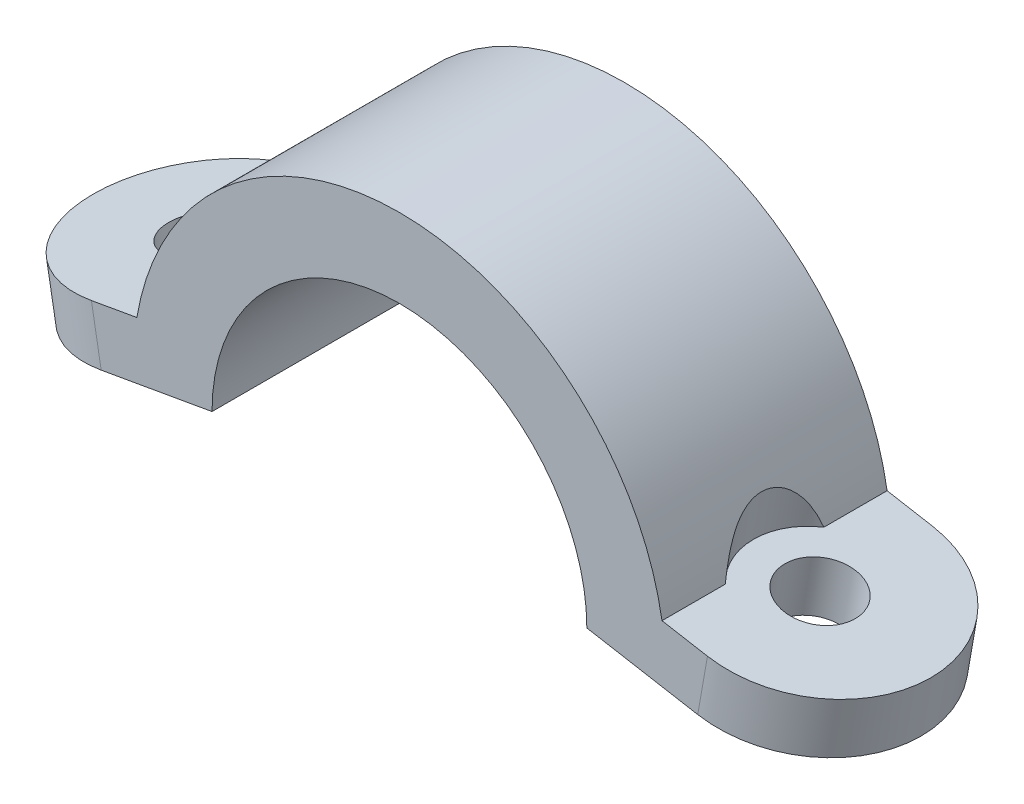
ISO-10303-21;
HEADER;
FILE_DESCRIPTION(('STEP AP214'),'2;1');
FILE_NAME('part.step','',(''),(''),'','','');
FILE_SCHEMA(('AUTOMOTIVE_DESIGN { 1 0 10303 214 1 1 1 1 }'));
ENDSEC;
DATA;
#1=APPLICATION_CONTEXT('core data for automotive mechanical design processes');
#2=APPLICATION_PROTOCOL_DEFINITION('international standard','automotive_design',2000,#1);
#3=PRODUCT_CONTEXT('',#1,'mechanical');
#4=PRODUCT('Part','Part','',(#3));
#5=PRODUCT_RELATED_PRODUCT_CATEGORY('part','',(#4));
#6=PRODUCT_DEFINITION_FORMATION('','',#4);
#7=PRODUCT_DEFINITION_CONTEXT('part definition',#1,'design');
#8=PRODUCT_DEFINITION('design','',#6,#7);
#9=PRODUCT_DEFINITION_SHAPE('','',#8);
#10=(LENGTH_UNIT() NAMED_UNIT(*) SI_UNIT(.MILLI.,.METRE.));
#11=(NAMED_UNIT(*) PLANE_ANGLE_UNIT() SI_UNIT($,.RADIAN.));
#12=(NAMED_UNIT(*) SI_UNIT($,.STERADIAN.) SOLID_ANGLE_UNIT());
#13=UNCERTAINTY_MEASURE_WITH_UNIT(LENGTH_MEASURE(1.E-05),#10,'distance_accuracy_value','');
#14=(GEOMETRIC_REPRESENTATION_CONTEXT(3) GLOBAL_UNCERTAINTY_ASSIGNED_CONTEXT((#13)) GLOBAL_UNIT_ASSIGNED_CONTEXT((#10,
#11,#12)) REPRESENTATION_CONTEXT('',''));
#15=CARTESIAN_POINT('',(0.,0.,0.));
#16=DIRECTION('',(0.,0.,1.));
#17=DIRECTION('',(1.,0.,0.));
#18=AXIS2_PLACEMENT_3D('',#15,#16,#17);
#19=CARTESIAN_POINT('',(0.,0.,20.));
#20=DIRECTION('',(0.,0.,-1.));
#21=DIRECTION('',(-1.,0.,0.));
#22=AXIS2_PLACEMENT_3D('',#19,#20,#21);
#23=CYLINDRICAL_SURFACE('',#22,23.65);
#24=CARTESIAN_POINT('',(23.3262302661561,3.89993353408295,5.62162046199867));
#25=CARTESIAN_POINT('',(23.30644063088,4.01830574828801,5.65914685636932));
#26=CARTESIAN_POINT('',(23.2858340207441,4.13600833364123,5.698336741421));
#27=CARTESIAN_POINT('',(23.2430778014222,4.36989342017987,5.78035355155573));
#28=CARTESIAN_POINT('',(23.2209277466485,4.48607547079663,5.82318152773288));
#29=CARTESIAN_POINT('',(23.1520998709963,4.83306100170746,5.95797901179696));
#30=CARTESIAN_POINT('',(23.103233955309,5.0611761257919,6.05591172927512));
#31=CARTESIAN_POINT('',(23.0000881375494,5.51113231345819,6.27196137903151));
#32=CARTESIAN_POINT('',(22.9457339856008,5.73281411546376,6.39037678934937));
#33=CARTESIAN_POINT('',(22.8342591825166,6.1618160346081,6.64918660241894));
#34=CARTESIAN_POINT('',(22.777145147347,6.36916785820421,6.78953008482778));
#35=CARTESIAN_POINT('',(22.6938644765552,6.65732507941525,7.0125063737805));
#36=CARTESIAN_POINT('',(22.66768867523,6.74584966364356,7.08523235587953));
#37=CARTESIAN_POINT('',(22.6157002612565,6.9181426676321,7.2362423707766));
#38=CARTESIAN_POINT('',(22.5898876658318,7.00191086240939,7.31452666609602));
#39=CARTESIAN_POINT('',(22.5137428337513,7.24447467954204,7.55758097791922));
#40=CARTESIAN_POINT('',(22.4645181908066,7.39516235951955,7.73103113285478));
#41=CARTESIAN_POINT('',(22.3724773496485,7.66916097569432,8.10439597728289));
#42=CARTESIAN_POINT('',(22.3297600631386,7.79206094728604,8.30464591160251));
#43=CARTESIAN_POINT('',(22.2750088713606,7.94666580474151,8.62089499790402));
#44=CARTESIAN_POINT('',(22.258314997512,7.99323691596019,8.72893392743267));
#45=CARTESIAN_POINT('',(22.228630559202,8.07541813228157,8.94956629874146));
#46=CARTESIAN_POINT('',(22.2156384371262,8.1110328480949,9.06215780205942));
#47=CARTESIAN_POINT('',(22.1889189597806,8.18392158066792,9.34353259244806));
#48=CARTESIAN_POINT('',(22.1775955735325,8.21444209323236,9.51436910694279));
#49=CARTESIAN_POINT('',(22.1651897700312,8.24785993174048,9.85900744635899));
#50=CARTESIAN_POINT('',(22.1641023127519,8.25077085226043,10.0328077697047));
#51=CARTESIAN_POINT('',(22.1722603902379,8.22882083807344,10.3783103656316));
#52=CARTESIAN_POINT('',(22.1815017567884,8.20397110622752,10.5500134562955));
#53=CARTESIAN_POINT('',(22.2093718815741,8.12821605867643,10.8867605861366));
#54=CARTESIAN_POINT('',(22.2280053124631,8.07729777338462,11.0518012665051));
#55=CARTESIAN_POINT('',(22.2736589868483,7.95054909332716,11.3765913223605));
#56=CARTESIAN_POINT('',(22.3009178115955,7.87400589341103,11.5360255355923));
#57=CARTESIAN_POINT('',(22.3614180371012,7.70051678589739,11.8418506873154));
#58=CARTESIAN_POINT('',(22.3946578977151,7.60357612965403,11.9882449691747));
#59=CARTESIAN_POINT('',(22.4864922524214,7.32882613337282,12.35248277158));
#60=CARTESIAN_POINT('',(22.5482036268907,7.13771152260392,12.5595718605891));
#61=CARTESIAN_POINT('',(22.6430822843764,6.82827129091435,12.8450463161906));
#62=CARTESIAN_POINT('',(22.6752220107078,6.72087188153151,12.9363134195287));
#63=CARTESIAN_POINT('',(22.7395957916161,6.4997303741187,13.1107899595754));
#64=CARTESIAN_POINT('',(22.7718298263305,6.38598953170413,13.1940009825369));
#65=CARTESIAN_POINT('',(22.8536969181584,6.08821682741531,13.3972876428312));
#66=CARTESIAN_POINT('',(22.902987706775,5.90042131912302,13.5119813970145));
#67=CARTESIAN_POINT('',(22.9988254038007,5.51507487681429,13.7253114443495));
#68=CARTESIAN_POINT('',(23.0453689168046,5.31751240347259,13.8239281221154));
#69=CARTESIAN_POINT('',(23.1336298954475,4.91919048614133,14.0051637203338));
#70=CARTESIAN_POINT('',(23.1754259166309,4.71857646600804,14.0880658047662));
#71=CARTESIAN_POINT('',(23.2346739329079,4.41396772271329,14.2034133696097));
#72=CARTESIAN_POINT('',(23.253825627743,4.31195566036316,14.2403182891578));
#73=CARTESIAN_POINT('',(23.2909369524817,4.10677799442416,14.3113677880365));
#74=CARTESIAN_POINT('',(23.3088967730166,4.00361257840466,14.3455128089835));
#75=CARTESIAN_POINT('',(23.3262302661561,3.89993353408304,14.3783795380015));
#76=B_SPLINE_CURVE_WITH_KNOTS('',3,(#24,#25,#26,#27,#28,#29,#30,#31,#32,#33,#34,#35,#36,#37,#38,
#39,#40,#41,#42,#43,#44,#45,#46,#47,#48,#49,#50,#51,#52,#53,#54,#55,#56,#57,#58,#59,#60,#61,#62,
#63,#64,#65,#66,#67,#68,#69,#70,#71,#72,#73,#74,#75),.UNSPECIFIED.,.F.,.F.,(4,2,2,2,2,2,2,2,2,2,
2,2,2,2,2,2,2,2,2,2,2,2,2,2,2,4),(0.,0.377203749385287,0.754516851159406,1.51272342244784,
2.28308804677755,3.05168964891729,3.40405008686208,3.75642717801792,4.45875573970466,
5.17087588748536,5.52679401462112,5.88256215744605,6.40176285143594,6.92070788499937,
7.4394435729908,7.95843759272381,8.49326932112514,9.0279635244455,9.888147145059,
10.3215891301265,10.7549455955862,11.4304506030711,12.10677371327,12.769421085989,
13.0998625865491,13.4302511074733),.UNSPECIFIED.);
#77=CARTESIAN_POINT('',(23.3262302661561,3.89993353408295,5.62162046199867));
#78=VERTEX_POINT('',#77);
#79=CARTESIAN_POINT('',(23.3262302661561,3.89993353408295,14.3783795380013));
#80=VERTEX_POINT('',#79);
#81=EDGE_CURVE('E111',#78,#80,#76,.T.);
#82=ORIENTED_EDGE('',*,*,#81,.F.);
#83=DIRECTION('',(0.,0.,-1.));
#84=VECTOR('',#83,1.);
#85=CARTESIAN_POINT('',(23.3262302661561,3.89993353408295,20.));
#86=LINE('',#85,#84);
#87=CARTESIAN_POINT('',(23.3262302661561,3.89993353408295,0.));
#88=VERTEX_POINT('',#87);
#89=EDGE_CURVE('E116',#88,#78,#86,.F.);
#90=ORIENTED_EDGE('',*,*,#89,.F.);
#91=CARTESIAN_POINT('',(0.,0.,0.));
#92=DIRECTION('',(0.,0.,1.));
#93=DIRECTION('',(1.,0.,0.));
#94=AXIS2_PLACEMENT_3D('',#91,#92,#93);
#95=CIRCLE('',#94,23.65);
#96=CARTESIAN_POINT('',(-23.3262302661561,3.89993353408292,0.));
#97=VERTEX_POINT('',#96);
#98=EDGE_CURVE('E148',#88,#97,#95,.T.);
#99=ORIENTED_EDGE('',*,*,#98,.T.);
#100=DIRECTION('',(0.,0.,-1.));
#101=VECTOR('',#100,1.);
#102=CARTESIAN_POINT('',(-23.3262302661561,3.89993353408292,20.));
#103=LINE('',#102,#101);
#104=CARTESIAN_POINT('',(-23.3262302661561,3.89993353408292,5.62162046199861));
#105=VERTEX_POINT('',#104);
#106=EDGE_CURVE('E192',#105,#97,#103,.T.);
#107=ORIENTED_EDGE('',*,*,#106,.F.);
#108=CARTESIAN_POINT('',(-23.3262302661561,3.89993353408292,14.3783795380014));
#109=CARTESIAN_POINT('',(-23.30644063088,4.01830574828797,14.3408531436307));
#110=CARTESIAN_POINT('',(-23.2858340207441,4.1360083336412,14.3016632585791));
#111=CARTESIAN_POINT('',(-23.2430778014222,4.36989342017984,14.2196464484443));
#112=CARTESIAN_POINT('',(-23.2209277466485,4.48607547079659,14.1768184722672));
#113=CARTESIAN_POINT('',(-23.1520998709963,4.83306100170743,14.0420209882031));
#114=CARTESIAN_POINT('',(-23.103233955309,5.06117612579187,13.944088270725));
#115=CARTESIAN_POINT('',(-23.0000881375494,5.51113231345816,13.7280386209686));
#116=CARTESIAN_POINT('',(-22.9457339856008,5.73281411546374,13.6096232106507));
#117=CARTESIAN_POINT('',(-22.8342591825166,6.16181603460808,13.3508133975812));
#118=CARTESIAN_POINT('',(-22.777145147347,6.3691678582042,13.2104699151723));
#119=CARTESIAN_POINT('',(-22.6938644765552,6.65732507941525,12.9874936262196));
#120=CARTESIAN_POINT('',(-22.66768867523,6.74584966364356,12.9147676441206));
#121=CARTESIAN_POINT('',(-22.6157002612565,6.91814266763211,12.7637576292235));
#122=CARTESIAN_POINT('',(-22.5898876658318,7.00191086240941,12.6854733339041));
#123=CARTESIAN_POINT('',(-22.5137428337513,7.24447467954207,12.4424190220809));
#124=CARTESIAN_POINT('',(-22.4645181908066,7.39516235951959,12.2689688671453));
#125=CARTESIAN_POINT('',(-22.3724773496485,7.66916097569437,11.8956040227172));
#126=CARTESIAN_POINT('',(-22.3297600631385,7.7920609472861,11.6953540883976));
#127=CARTESIAN_POINT('',(-22.2750088713605,7.94666580474159,11.3791050020961));
#128=CARTESIAN_POINT('',(-22.258314997512,7.99323691596027,11.2710660725674));
#129=CARTESIAN_POINT('',(-22.228630559202,8.07541813228166,11.0504337012586));
#130=CARTESIAN_POINT('',(-22.2156384371261,8.11103284809499,10.9378421979407));
#131=CARTESIAN_POINT('',(-22.1889189597805,8.18392158066801,10.656467407552));
#132=CARTESIAN_POINT('',(-22.1775955735324,8.21444209323247,10.4856308930573));
#133=CARTESIAN_POINT('',(-22.1651897700311,8.24785993174059,10.1409925536411));
#134=CARTESIAN_POINT('',(-22.1641023127519,8.25077085226055,9.96719223029536));
#135=CARTESIAN_POINT('',(-22.1722603902379,8.22882083807358,9.6216896343685));
#136=CARTESIAN_POINT('',(-22.1815017567884,8.20397110622766,9.44998654370463));
#137=CARTESIAN_POINT('',(-22.209371881574,8.12821605867657,9.1132394138635));
#138=CARTESIAN_POINT('',(-22.2280053124631,8.07729777338478,8.94819873349494));
#139=CARTESIAN_POINT('',(-22.2736589868483,7.95054909332732,8.62340867763959));
#140=CARTESIAN_POINT('',(-22.3009178115954,7.87400589341119,8.46397446440773));
#141=CARTESIAN_POINT('',(-22.3614180371011,7.70051678589757,8.1581493126847));
#142=CARTESIAN_POINT('',(-22.3946578977151,7.60357612965421,8.01175503082536));
#143=CARTESIAN_POINT('',(-22.4864922524214,7.32882613337302,7.64751722842004));
#144=CARTESIAN_POINT('',(-22.5482036268907,7.13771152260413,7.440428139411));
#145=CARTESIAN_POINT('',(-22.6430822843763,6.82827129091457,7.15495368380944));
#146=CARTESIAN_POINT('',(-22.6752220107077,6.72087188153173,7.06368658047142));
#147=CARTESIAN_POINT('',(-22.739595791616,6.49973037411894,6.88921004042465));
#148=CARTESIAN_POINT('',(-22.7718298263305,6.38598953170437,6.80599901746321));
#149=CARTESIAN_POINT('',(-22.8536969181583,6.08821682741554,6.60271235716882));
#150=CARTESIAN_POINT('',(-22.9029877067749,5.90042131912323,6.48801860298552));
#151=CARTESIAN_POINT('',(-22.9988254038007,5.51507487681446,6.27468855565052));
#152=CARTESIAN_POINT('',(-23.0453689168045,5.31751240347273,6.17607187788457));
#153=CARTESIAN_POINT('',(-23.1336298954474,4.91919048614142,5.99483627966613));
#154=CARTESIAN_POINT('',(-23.1754259166309,4.71857646600811,5.91193419523377));
#155=CARTESIAN_POINT('',(-23.2346739329079,4.41396772271332,5.79658663039021));
#156=CARTESIAN_POINT('',(-23.253825627743,4.31195566036318,5.75968171084215));
#157=CARTESIAN_POINT('',(-23.2909369524817,4.10677799442415,5.6886322119634));
#158=CARTESIAN_POINT('',(-23.3088967730166,4.00361257840464,5.65448719101644));
#159=CARTESIAN_POINT('',(-23.3262302661561,3.89993353408301,5.62162046199848));
#160=B_SPLINE_CURVE_WITH_KNOTS('',3,(#108,#109,#110,#111,#112,#113,#114,#115,#116,#117,#118,
#119,#120,#121,#122,#123,#124,#125,#126,#127,#128,#129,#130,#131,#132,#133,#134,#135,#136,#137,
#138,#139,#140,#141,#142,#143,#144,#145,#146,#147,#148,#149,#150,#151,#152,#153,#154,#155,#156,
#157,#158,#159),.UNSPECIFIED.,.F.,.F.,(4,2,2,2,2,2,2,2,2,2,2,2,2,2,2,2,2,2,2,2,2,2,2,2,2,4),(0.,
0.377203749385286,0.754516851159404,1.51272342244784,2.28308804677755,3.05168964891729,
3.40405008686209,3.75642717801794,4.4587557397047,5.17087588748542,5.52679401462119,
5.88256215744613,6.40176285143603,6.92070788499945,7.43944357299089,7.9584375927239,
8.49326932112522,9.02796352444558,9.88814714505906,10.3215891301265,10.7549455955862,
11.4304506030712,12.1067737132702,12.7694210859893,13.0998625865494,13.4302511074736),.UNSPECIFIED.);
#161=CARTESIAN_POINT('',(-23.3262302661561,3.89993353408292,14.3783795380014));
#162=VERTEX_POINT('',#161);
#163=EDGE_CURVE('E218',#162,#105,#160,.T.);
#164=ORIENTED_EDGE('',*,*,#163,.F.);
#165=CARTESIAN_POINT('',(-23.3262302661561,3.89993353408292,20.));
#166=VERTEX_POINT('',#165);
#167=EDGE_CURVE('E195',#166,#162,#103,.T.);
#168=ORIENTED_EDGE('',*,*,#167,.F.);
#169=CARTESIAN_POINT('',(0.,0.,20.));
#170=DIRECTION('',(0.,0.,1.));
#171=DIRECTION('',(1.,0.,0.));
#172=AXIS2_PLACEMENT_3D('',#169,#170,#171);
#173=CIRCLE('',#172,23.65);
#174=CARTESIAN_POINT('',(23.3262302661561,3.89993353408295,20.));
#175=VERTEX_POINT('',#174);
#176=EDGE_CURVE('E142',#175,#166,#173,.T.);
#177=ORIENTED_EDGE('',*,*,#176,.F.);
#178=EDGE_CURVE('E119',#80,#175,#86,.F.);
#179=ORIENTED_EDGE('',*,*,#178,.F.);
#180=EDGE_LOOP('',(#82,#90,#99,#107,#164,#168,#177,#179));
#181=FACE_BOUND('',#180,.T.);
#182=ADVANCED_FACE('F34',(#181),#23,.T.);
#183=CARTESIAN_POINT('',(0.,0.,20.));
#184=DIRECTION('',(0.,0.,-1.));
#185=DIRECTION('',(-1.,0.,0.));
#186=AXIS2_PLACEMENT_3D('',#183,#184,#185);
#187=CYLINDRICAL_SURFACE('',#186,16.65);
#188=CARTESIAN_POINT('',(0.,0.,0.));
#189=DIRECTION('',(0.,0.,-1.));
#190=DIRECTION('',(1.,0.,0.));
#191=AXIS2_PLACEMENT_3D('',#188,#189,#190);
#192=CIRCLE('',#191,16.65);
#193=CARTESIAN_POINT('',(-16.65,0.,0.));
#194=VERTEX_POINT('',#193);
#195=CARTESIAN_POINT('',(16.65,0.,0.));
#196=VERTEX_POINT('',#195);
#197=EDGE_CURVE('E126',#194,#196,#192,.T.);
#198=ORIENTED_EDGE('',*,*,#197,.T.);
#199=DIRECTION('',(0.,0.,-1.));
#200=VECTOR('',#199,1.);
#201=CARTESIAN_POINT('',(16.65,0.,20.));
#202=LINE('',#201,#200);
#203=CARTESIAN_POINT('',(16.65,0.,20.));
#204=VERTEX_POINT('',#203);
#205=EDGE_CURVE('E11',#204,#196,#202,.T.);
#206=ORIENTED_EDGE('',*,*,#205,.F.);
#207=CARTESIAN_POINT('',(0.,0.,20.));
#208=DIRECTION('',(0.,0.,-1.));
#209=DIRECTION('',(1.,0.,0.));
#210=AXIS2_PLACEMENT_3D('',#207,#208,#209);
#211=CIRCLE('',#210,16.65);
#212=CARTESIAN_POINT('',(-16.65,0.,20.));
#213=VERTEX_POINT('',#212);
#214=EDGE_CURVE('E136',#213,#204,#211,.T.);
#215=ORIENTED_EDGE('',*,*,#214,.F.);
#216=DIRECTION('',(0.,0.,-1.));
#217=VECTOR('',#216,1.);
#218=CARTESIAN_POINT('',(-16.65,0.,20.));
#219=LINE('',#218,#217);
#220=EDGE_CURVE('E42',#213,#194,#219,.T.);
#221=ORIENTED_EDGE('',*,*,#220,.T.);
#222=EDGE_LOOP('',(#198,#206,#215,#221));
#223=FACE_BOUND('',#222,.T.);
#224=ADVANCED_FACE('F36',(#223),#187,.F.);
#225=CARTESIAN_POINT('',(16.65,0.,20.));
#226=DIRECTION('',(0.173648177666931,0.984807753012208,0.));
#227=DIRECTION('',(-0.984807753012208,0.173648177666931,0.));
#228=AXIS2_PLACEMENT_3D('',#225,#226,#227);
#229=PLANE('',#228);
#230=CARTESIAN_POINT('',(26.4980775301221,-1.73648177666931,10.));
#231=DIRECTION('',(0.173648177666931,0.984807753012208,0.));
#232=DIRECTION('',(-0.984807753012208,0.173648177666931,0.));
#233=AXIS2_PLACEMENT_3D('',#230,#231,#232);
#234=CIRCLE('',#233,3.175);
#235=CARTESIAN_POINT('',(23.3713129143083,-1.1851488125768,10.));
#236=VERTEX_POINT('',#235);
#237=EDGE_CURVE('E313',#236,#236,#234,.T.);
#238=ORIENTED_EDGE('',*,*,#237,.T.);
#239=EDGE_LOOP('',(#238));
#240=FACE_BOUND('',#239,.T.);
#241=DIRECTION('',(0.984807753012208,-0.173648177666931,0.));
#242=VECTOR('',#241,1.);
#243=CARTESIAN_POINT('',(16.65,0.,0.));
#244=LINE('',#243,#242);
#245=CARTESIAN_POINT('',(26.4980775301221,-1.73648177666931,0.));
#246=VERTEX_POINT('',#245);
#247=EDGE_CURVE('E129',#196,#246,#244,.T.);
#248=ORIENTED_EDGE('',*,*,#247,.T.);
#249=CARTESIAN_POINT('',(26.4980775301221,-1.73648177666931,10.));
#250=DIRECTION('',(-0.173648177666931,-0.984807753012208,0.));
#251=DIRECTION('',(0.984807753012208,-0.173648177666931,0.));
#252=AXIS2_PLACEMENT_3D('',#249,#250,#251);
#253=CIRCLE('',#252,10.);
#254=CARTESIAN_POINT('',(26.4980775301221,-1.73648177666931,20.));
#255=VERTEX_POINT('',#254);
#256=EDGE_CURVE('E166',#246,#255,#253,.T.);
#257=ORIENTED_EDGE('',*,*,#256,.T.);
#258=DIRECTION('',(0.984807753012208,-0.173648177666931,0.));
#259=VECTOR('',#258,1.);
#260=CARTESIAN_POINT('',(16.65,0.,20.));
#261=LINE('',#260,#259);
#262=EDGE_CURVE('E139',#204,#255,#261,.T.);
#263=ORIENTED_EDGE('',*,*,#262,.F.);
#264=ORIENTED_EDGE('',*,*,#205,.T.);
#265=EDGE_LOOP('',(#248,#257,#263,#264));
#266=FACE_BOUND('',#265,.T.);
#267=ADVANCED_FACE('F165',(#240,#266),#229,.F.);
#268=CARTESIAN_POINT('',(-16.65,0.,20.));
#269=DIRECTION('',(-0.173648177666924,0.984807753012209,0.));
#270=DIRECTION('',(-0.984807753012209,-0.173648177666924,0.));
#271=AXIS2_PLACEMENT_3D('',#268,#269,#270);
#272=PLANE('',#271);
#273=CARTESIAN_POINT('',(-26.4980775301221,-1.73648177666923,10.));
#274=DIRECTION('',(-0.173648177666924,0.984807753012209,0.));
#275=DIRECTION('',(-0.984807753012209,-0.173648177666924,0.));
#276=AXIS2_PLACEMENT_3D('',#273,#274,#275);
#277=CIRCLE('',#276,3.175);
#278=CARTESIAN_POINT('',(-29.6248421459358,-2.28781474076172,10.));
#279=VERTEX_POINT('',#278);
#280=EDGE_CURVE('E179',#279,#279,#277,.T.);
#281=ORIENTED_EDGE('',*,*,#280,.T.);
#282=EDGE_LOOP('',(#281));
#283=FACE_BOUND('',#282,.T.);
#284=DIRECTION('',(0.984807753012209,0.173648177666924,0.));
#285=VECTOR('',#284,1.);
#286=CARTESIAN_POINT('',(-16.65,0.,0.));
#287=LINE('',#286,#285);
#288=CARTESIAN_POINT('',(-26.4980775301221,-1.73648177666932,0.));
#289=VERTEX_POINT('',#288);
#290=EDGE_CURVE('E140',#289,#194,#287,.T.);
#291=ORIENTED_EDGE('',*,*,#290,.T.);
#292=ORIENTED_EDGE('',*,*,#220,.F.);
#293=DIRECTION('',(0.984807753012209,0.173648177666924,0.));
#294=VECTOR('',#293,1.);
#295=CARTESIAN_POINT('',(-16.65,0.,20.));
#296=LINE('',#295,#294);
#297=CARTESIAN_POINT('',(-26.4980775301221,-1.73648177666932,20.));
#298=VERTEX_POINT('',#297);
#299=EDGE_CURVE('E145',#298,#213,#296,.T.);
#300=ORIENTED_EDGE('',*,*,#299,.F.);
#301=CARTESIAN_POINT('',(-26.4980775301221,-1.73648177666932,10.));
#302=DIRECTION('',(0.173648177666927,-0.984807753012209,0.));
#303=DIRECTION('',(0.984807753012209,0.173648177666927,0.));
#304=AXIS2_PLACEMENT_3D('',#301,#302,#303);
#305=CIRCLE('',#304,10.);
#306=EDGE_CURVE('E176',#298,#289,#305,.T.);
#307=ORIENTED_EDGE('',*,*,#306,.T.);
#308=EDGE_LOOP('',(#291,#292,#300,#307));
#309=FACE_BOUND('',#308,.T.);
#310=ADVANCED_FACE('F175',(#283,#309),#272,.F.);
#311=CARTESIAN_POINT('',(0.,0.,20.));
#312=DIRECTION('',(0.,0.,1.));
#313=DIRECTION('',(1.,0.,0.));
#314=AXIS2_PLACEMENT_3D('',#311,#312,#313);
#315=PLANE('',#314);
#316=ORIENTED_EDGE('',*,*,#299,.T.);
#317=ORIENTED_EDGE('',*,*,#214,.T.);
#318=ORIENTED_EDGE('',*,*,#262,.T.);
#319=DIRECTION('',(-0.173648177666931,-0.984807753012208,0.));
#320=VECTOR('',#319,1.);
#321=CARTESIAN_POINT('',(27.3663184184567,3.18755698839173,20.));
#322=LINE('',#321,#320);
#323=CARTESIAN_POINT('',(27.3663184184567,3.18755698839173,20.));
#324=VERTEX_POINT('',#323);
#325=EDGE_CURVE('E134',#324,#255,#322,.T.);
#326=ORIENTED_EDGE('',*,*,#325,.F.);
#327=DIRECTION('',(-0.984807753012208,0.173648177666931,0.));
#328=VECTOR('',#327,1.);
#329=CARTESIAN_POINT('',(17.5182408883347,4.92403876506104,20.));
#330=LINE('',#329,#328);
#331=EDGE_CURVE('E200',#324,#175,#330,.T.);
#332=ORIENTED_EDGE('',*,*,#331,.T.);
#333=ORIENTED_EDGE('',*,*,#176,.T.);
#334=DIRECTION('',(-0.984807753012209,-0.173648177666927,0.));
#335=VECTOR('',#334,1.);
#336=CARTESIAN_POINT('',(-27.3663184184567,3.18755698839172,20.));
#337=LINE('',#336,#335);
#338=CARTESIAN_POINT('',(-27.3663184184567,3.18755698839172,20.));
#339=VERTEX_POINT('',#338);
#340=EDGE_CURVE('E189',#166,#339,#337,.T.);
#341=ORIENTED_EDGE('',*,*,#340,.T.);
#342=DIRECTION('',(0.173648177666927,-0.984807753012209,0.));
#343=VECTOR('',#342,1.);
#344=CARTESIAN_POINT('',(-27.3663184184567,3.18755698839172,20.));
#345=LINE('',#344,#343);
#346=EDGE_CURVE('E172',#339,#298,#345,.T.);
#347=ORIENTED_EDGE('',*,*,#346,.T.);
#348=EDGE_LOOP('',(#316,#317,#318,#326,#332,#333,#341,#347));
#349=FACE_BOUND('',#348,.T.);
#350=ADVANCED_FACE('F169',(#349),#315,.T.);
#351=CARTESIAN_POINT('',(0.,0.,0.));
#352=DIRECTION('',(0.,0.,1.));
#353=DIRECTION('',(1.,0.,0.));
#354=AXIS2_PLACEMENT_3D('',#351,#352,#353);
#355=PLANE('',#354);
#356=ORIENTED_EDGE('',*,*,#197,.F.);
#357=ORIENTED_EDGE('',*,*,#290,.F.);
#358=DIRECTION('',(0.173648177666927,-0.984807753012209,0.));
#359=VECTOR('',#358,1.);
#360=CARTESIAN_POINT('',(-27.3663184184567,3.18755698839172,0.));
#361=LINE('',#360,#359);
#362=CARTESIAN_POINT('',(-27.3663184184567,3.18755698839172,0.));
#363=VERTEX_POINT('',#362);
#364=EDGE_CURVE('E193',#363,#289,#361,.T.);
#365=ORIENTED_EDGE('',*,*,#364,.F.);
#366=DIRECTION('',(0.984807753012209,0.173648177666927,0.));
#367=VECTOR('',#366,1.);
#368=CARTESIAN_POINT('',(-17.5182408883346,4.92403876506099,0.));
#369=LINE('',#368,#367);
#370=EDGE_CURVE('E182',#363,#97,#369,.T.);
#371=ORIENTED_EDGE('',*,*,#370,.T.);
#372=ORIENTED_EDGE('',*,*,#98,.F.);
#373=DIRECTION('',(0.984807753012208,-0.173648177666931,0.));
#374=VECTOR('',#373,1.);
#375=CARTESIAN_POINT('',(27.3663184184567,3.18755698839173,0.));
#376=LINE('',#375,#374);
#377=CARTESIAN_POINT('',(27.3663184184567,3.18755698839173,0.));
#378=VERTEX_POINT('',#377);
#379=EDGE_CURVE('E125',#88,#378,#376,.T.);
#380=ORIENTED_EDGE('',*,*,#379,.T.);
#381=DIRECTION('',(-0.173648177666931,-0.984807753012208,0.));
#382=VECTOR('',#381,1.);
#383=CARTESIAN_POINT('',(27.3663184184567,3.18755698839173,0.));
#384=LINE('',#383,#382);
#385=EDGE_CURVE('E131',#378,#246,#384,.T.);
#386=ORIENTED_EDGE('',*,*,#385,.T.);
#387=ORIENTED_EDGE('',*,*,#247,.F.);
#388=EDGE_LOOP('',(#356,#357,#365,#371,#372,#380,#386,#387));
#389=FACE_BOUND('',#388,.T.);
#390=ADVANCED_FACE('F158',(#389),#355,.F.);
#391=CARTESIAN_POINT('',(27.3663184184567,3.18755698839173,10.));
#392=DIRECTION('',(-0.173648177666931,-0.984807753012208,0.));
#393=DIRECTION('',(0.984807753012208,-0.173648177666931,0.));
#394=AXIS2_PLACEMENT_3D('',#391,#392,#393);
#395=PLANE('',#394);
#396=CARTESIAN_POINT('',(27.3663184184567,3.18755698839173,10.));
#397=DIRECTION('',(0.173648177666931,0.984807753012208,0.));
#398=DIRECTION('',(-0.984807753012208,0.173648177666931,0.));
#399=AXIS2_PLACEMENT_3D('',#396,#397,#398);
#400=CIRCLE('',#399,3.175);
#401=CARTESIAN_POINT('',(24.239553802643,3.73888995248423,10.));
#402=VERTEX_POINT('',#401);
#403=EDGE_CURVE('E120',#402,#402,#400,.T.);
#404=ORIENTED_EDGE('',*,*,#403,.F.);
#405=EDGE_LOOP('',(#404));
#406=FACE_BOUND('',#405,.T.);
#407=ORIENTED_EDGE('',*,*,#89,.T.);
#408=CARTESIAN_POINT('',(27.3663184184567,3.18755698839173,10.));
#409=DIRECTION('',(0.173648177666931,0.984807753012208,0.));
#410=DIRECTION('',(-0.984807753012208,0.173648177666931,0.));
#411=AXIS2_PLACEMENT_3D('',#408,#409,#410);
#412=CIRCLE('',#411,5.99999999999999);
#413=EDGE_CURVE('E49',#78,#80,#412,.T.);
#414=ORIENTED_EDGE('',*,*,#413,.T.);
#415=ORIENTED_EDGE('',*,*,#178,.T.);
#416=ORIENTED_EDGE('',*,*,#331,.F.);
#417=CARTESIAN_POINT('',(27.3663184184567,3.18755698839173,10.));
#418=DIRECTION('',(-0.173648177666931,-0.984807753012208,0.));
#419=DIRECTION('',(0.984807753012208,-0.173648177666931,0.));
#420=AXIS2_PLACEMENT_3D('',#417,#418,#419);
#421=CIRCLE('',#420,10.);
#422=EDGE_CURVE('E197',#378,#324,#421,.T.);
#423=ORIENTED_EDGE('',*,*,#422,.F.);
#424=ORIENTED_EDGE('',*,*,#379,.F.);
#425=EDGE_LOOP('',(#407,#414,#415,#416,#423,#424));
#426=FACE_BOUND('',#425,.T.);
#427=ADVANCED_FACE('F123',(#406,#426),#395,.F.);
#428=CARTESIAN_POINT('',(27.3663184184567,3.18755698839173,10.));
#429=DIRECTION('',(-0.173648177666931,-0.984807753012208,0.));
#430=DIRECTION('',(0.984807753012208,-0.173648177666931,0.));
#431=AXIS2_PLACEMENT_3D('',#428,#429,#430);
#432=CYLINDRICAL_SURFACE('',#431,10.);
#433=ORIENTED_EDGE('',*,*,#256,.F.);
#434=ORIENTED_EDGE('',*,*,#385,.F.);
#435=ORIENTED_EDGE('',*,*,#422,.T.);
#436=ORIENTED_EDGE('',*,*,#325,.T.);
#437=EDGE_LOOP('',(#433,#434,#435,#436));
#438=FACE_BOUND('',#437,.T.);
#439=ADVANCED_FACE('F205',(#438),#432,.T.);
#440=CARTESIAN_POINT('',(-27.3663184184567,3.18755698839172,10.));
#441=DIRECTION('',(0.173648177666927,-0.984807753012209,0.));
#442=DIRECTION('',(0.984807753012209,0.173648177666927,0.));
#443=AXIS2_PLACEMENT_3D('',#440,#441,#442);
#444=PLANE('',#443);
#445=CARTESIAN_POINT('',(-27.3663184184567,3.18755698839172,10.));
#446=DIRECTION('',(-0.173648177666927,0.984807753012209,0.));
#447=DIRECTION('',(-0.984807753012209,-0.173648177666927,0.));
#448=AXIS2_PLACEMENT_3D('',#445,#446,#447);
#449=CIRCLE('',#448,3.175);
#450=CARTESIAN_POINT('',(-30.4930830342705,2.63622402429923,10.));
#451=VERTEX_POINT('',#450);
#452=EDGE_CURVE('E185',#451,#451,#449,.T.);
#453=ORIENTED_EDGE('',*,*,#452,.F.);
#454=EDGE_LOOP('',(#453));
#455=FACE_BOUND('',#454,.T.);
#456=ORIENTED_EDGE('',*,*,#167,.T.);
#457=CARTESIAN_POINT('',(-27.3663184184567,3.18755698839172,10.));
#458=DIRECTION('',(-0.173648177666927,0.984807753012209,0.));
#459=DIRECTION('',(-0.984807753012209,-0.173648177666927,0.));
#460=AXIS2_PLACEMENT_3D('',#457,#458,#459);
#461=CIRCLE('',#460,6.);
#462=EDGE_CURVE('E57',#162,#105,#461,.T.);
#463=ORIENTED_EDGE('',*,*,#462,.T.);
#464=ORIENTED_EDGE('',*,*,#106,.T.);
#465=ORIENTED_EDGE('',*,*,#370,.F.);
#466=CARTESIAN_POINT('',(-27.3663184184567,3.18755698839172,10.));
#467=DIRECTION('',(0.173648177666927,-0.984807753012209,0.));
#468=DIRECTION('',(0.984807753012209,0.173648177666927,0.));
#469=AXIS2_PLACEMENT_3D('',#466,#467,#468);
#470=CIRCLE('',#469,10.);
#471=EDGE_CURVE('E178',#339,#363,#470,.T.);
#472=ORIENTED_EDGE('',*,*,#471,.F.);
#473=ORIENTED_EDGE('',*,*,#340,.F.);
#474=EDGE_LOOP('',(#456,#463,#464,#465,#472,#473));
#475=FACE_BOUND('',#474,.T.);
#476=ADVANCED_FACE('F212',(#455,#475),#444,.F.);
#477=CARTESIAN_POINT('',(-27.3663184184567,3.18755698839172,10.));
#478=DIRECTION('',(0.173648177666927,-0.984807753012209,0.));
#479=DIRECTION('',(0.984807753012209,0.173648177666927,0.));
#480=AXIS2_PLACEMENT_3D('',#477,#478,#479);
#481=CYLINDRICAL_SURFACE('',#480,10.);
#482=ORIENTED_EDGE('',*,*,#306,.F.);
#483=ORIENTED_EDGE('',*,*,#346,.F.);
#484=ORIENTED_EDGE('',*,*,#471,.T.);
#485=ORIENTED_EDGE('',*,*,#364,.T.);
#486=EDGE_LOOP('',(#482,#483,#484,#485));
#487=FACE_BOUND('',#486,.T.);
#488=ADVANCED_FACE('F210',(#487),#481,.T.);
#489=CARTESIAN_POINT('',(-24.2799555076788,-14.3160768762455,10.));
#490=DIRECTION('',(-0.173648177666927,0.984807753012209,0.));
#491=DIRECTION('',(-0.984807753012209,-0.173648177666927,0.));
#492=AXIS2_PLACEMENT_3D('',#489,#490,#491);
#493=CYLINDRICAL_SURFACE('',#492,3.175);
#494=ORIENTED_EDGE('',*,*,#452,.T.);
#495=EDGE_LOOP('',(#494));
#496=FACE_BOUND('',#495,.T.);
#497=ORIENTED_EDGE('',*,*,#280,.F.);
#498=EDGE_LOOP('',(#497));
#499=FACE_BOUND('',#498,.T.);
#500=ADVANCED_FACE('F234',(#496,#499),#493,.F.);
#501=CARTESIAN_POINT('',(-28.2345593067913,8.11159575345277,10.));
#502=DIRECTION('',(0.173648177666927,-0.984807753012209,0.));
#503=DIRECTION('',(0.984807753012209,0.173648177666927,0.));
#504=AXIS2_PLACEMENT_3D('',#501,#502,#503);
#505=CYLINDRICAL_SURFACE('',#504,6.);
#506=ORIENTED_EDGE('',*,*,#163,.T.);
#507=ORIENTED_EDGE('',*,*,#462,.F.);
#508=EDGE_LOOP('',(#506,#507));
#509=FACE_BOUND('',#508,.T.);
#510=ADVANCED_FACE('F228',(#509),#505,.F.);
#511=CARTESIAN_POINT('',(24.2799555076787,-14.3160768762458,10.));
#512=DIRECTION('',(0.173648177666931,0.984807753012208,0.));
#513=DIRECTION('',(-0.984807753012208,0.173648177666931,0.));
#514=AXIS2_PLACEMENT_3D('',#511,#512,#513);
#515=CYLINDRICAL_SURFACE('',#514,3.175);
#516=ORIENTED_EDGE('',*,*,#403,.T.);
#517=EDGE_LOOP('',(#516));
#518=FACE_BOUND('',#517,.T.);
#519=ORIENTED_EDGE('',*,*,#237,.F.);
#520=EDGE_LOOP('',(#519));
#521=FACE_BOUND('',#520,.T.);
#522=ADVANCED_FACE('F233',(#518,#521),#515,.F.);
#523=CARTESIAN_POINT('',(28.2345593067914,8.11159575345277,10.));
#524=DIRECTION('',(-0.173648177666931,-0.984807753012208,0.));
#525=DIRECTION('',(0.984807753012208,-0.173648177666931,0.));
#526=AXIS2_PLACEMENT_3D('',#523,#524,#525);
#527=CYLINDRICAL_SURFACE('',#526,5.99999999999999);
#528=ORIENTED_EDGE('',*,*,#81,.T.);
#529=ORIENTED_EDGE('',*,*,#413,.F.);
#530=EDGE_LOOP('',(#528,#529));
#531=FACE_BOUND('',#530,.T.);
#532=ADVANCED_FACE('F110',(#531),#527,.F.);
#533=CLOSED_SHELL('',(#182,#224,#267,#310,#350,#390,#427,#439,#476,#488,#500,#510,#522,#532));
#534=MANIFOLD_SOLID_BREP('B2',#533);
#535=ADVANCED_BREP_SHAPE_REPRESENTATION('',(#18,#534),#14);
#536=SHAPE_DEFINITION_REPRESENTATION(#9,#535);
ENDSEC;
END-ISO-10303-21;
